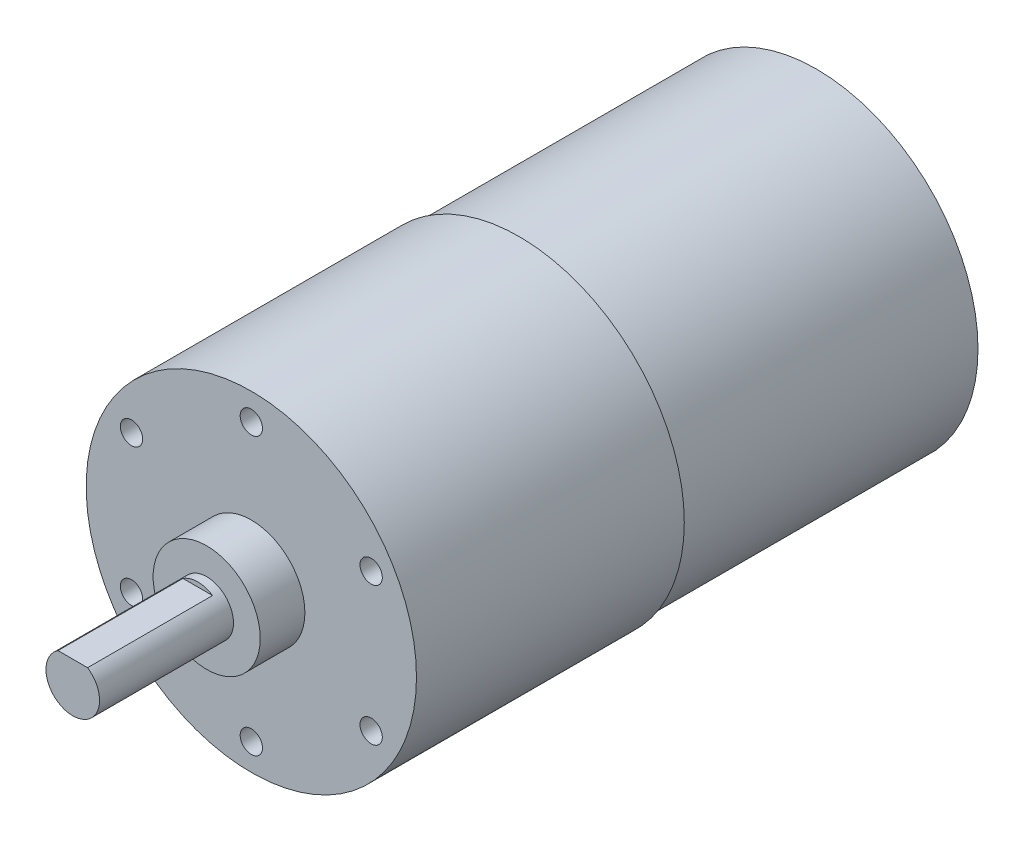
ISO-10303-21;
HEADER;
FILE_DESCRIPTION(('STEP AP214'),'2;1');
FILE_NAME('part.step','',(''),(''),'','','');
FILE_SCHEMA(('AUTOMOTIVE_DESIGN { 1 0 10303 214 1 1 1 1 }'));
ENDSEC;
DATA;
#1=APPLICATION_CONTEXT('core data for automotive mechanical design processes');
#2=APPLICATION_PROTOCOL_DEFINITION('international standard','automotive_design',2000,#1);
#3=PRODUCT_CONTEXT('',#1,'mechanical');
#4=PRODUCT('Part','Part','',(#3));
#5=PRODUCT_RELATED_PRODUCT_CATEGORY('part','',(#4));
#6=PRODUCT_DEFINITION_FORMATION('','',#4);
#7=PRODUCT_DEFINITION_CONTEXT('part definition',#1,'design');
#8=PRODUCT_DEFINITION('design','',#6,#7);
#9=PRODUCT_DEFINITION_SHAPE('','',#8);
#10=(LENGTH_UNIT() NAMED_UNIT(*) SI_UNIT(.MILLI.,.METRE.));
#11=(NAMED_UNIT(*) PLANE_ANGLE_UNIT() SI_UNIT($,.RADIAN.));
#12=(NAMED_UNIT(*) SI_UNIT($,.STERADIAN.) SOLID_ANGLE_UNIT());
#13=UNCERTAINTY_MEASURE_WITH_UNIT(LENGTH_MEASURE(1.E-05),#10,'distance_accuracy_value','');
#14=(GEOMETRIC_REPRESENTATION_CONTEXT(3) GLOBAL_UNCERTAINTY_ASSIGNED_CONTEXT((#13)) GLOBAL_UNIT_ASSIGNED_CONTEXT((#10,
#11,#12)) REPRESENTATION_CONTEXT('',''));
#15=CARTESIAN_POINT('',(0.,0.,0.));
#16=DIRECTION('',(0.,0.,1.));
#17=DIRECTION('',(1.,0.,0.));
#18=AXIS2_PLACEMENT_3D('',#15,#16,#17);
#19=CARTESIAN_POINT('',(0.,0.,30.));
#20=DIRECTION('',(0.,0.,-1.));
#21=DIRECTION('',(-1.,0.,0.));
#22=AXIS2_PLACEMENT_3D('',#19,#20,#21);
#23=CYLINDRICAL_SURFACE('',#22,18.5);
#24=CARTESIAN_POINT('',(0.,0.,30.));
#25=DIRECTION('',(0.,0.,1.));
#26=DIRECTION('',(1.,0.,0.));
#27=AXIS2_PLACEMENT_3D('',#24,#25,#26);
#28=CIRCLE('',#27,18.5);
#29=CARTESIAN_POINT('',(18.5,0.,30.));
#30=VERTEX_POINT('',#29);
#31=EDGE_CURVE('E151',#30,#30,#28,.T.);
#32=ORIENTED_EDGE('',*,*,#31,.F.);
#33=EDGE_LOOP('',(#32));
#34=FACE_BOUND('',#33,.T.);
#35=CARTESIAN_POINT('',(0.,0.,0.));
#36=DIRECTION('',(0.,0.,1.));
#37=DIRECTION('',(1.,0.,0.));
#38=AXIS2_PLACEMENT_3D('',#35,#36,#37);
#39=CIRCLE('',#38,18.5);
#40=CARTESIAN_POINT('',(18.5,0.,0.));
#41=VERTEX_POINT('',#40);
#42=EDGE_CURVE('E40',#41,#41,#39,.T.);
#43=ORIENTED_EDGE('',*,*,#42,.T.);
#44=EDGE_LOOP('',(#43));
#45=FACE_BOUND('',#44,.T.);
#46=ADVANCED_FACE('F37',(#34,#45),#23,.T.);
#47=CARTESIAN_POINT('',(0.,0.,30.));
#48=DIRECTION('',(0.,0.,1.));
#49=DIRECTION('',(1.,0.,0.));
#50=AXIS2_PLACEMENT_3D('',#47,#48,#49);
#51=PLANE('',#50);
#52=CARTESIAN_POINT('',(0.,15.5,30.));
#53=DIRECTION('',(0.,0.,1.));
#54=DIRECTION('',(1.,0.,0.));
#55=AXIS2_PLACEMENT_3D('',#52,#53,#54);
#56=CIRCLE('',#55,1.24999999999999);
#57=CARTESIAN_POINT('',(1.24999999999999,15.5,30.));
#58=VERTEX_POINT('',#57);
#59=EDGE_CURVE('E96',#58,#58,#56,.T.);
#60=ORIENTED_EDGE('',*,*,#59,.F.);
#61=EDGE_LOOP('',(#60));
#62=FACE_BOUND('',#61,.T.);
#63=CARTESIAN_POINT('',(13.4233937586592,7.75000000000076,30.));
#64=DIRECTION('',(0.,0.,1.));
#65=DIRECTION('',(1.,0.,0.));
#66=AXIS2_PLACEMENT_3D('',#63,#64,#65);
#67=CIRCLE('',#66,1.24999999999999);
#68=CARTESIAN_POINT('',(14.6733937586592,7.75000000000076,30.));
#69=VERTEX_POINT('',#68);
#70=EDGE_CURVE('E95',#69,#69,#67,.T.);
#71=ORIENTED_EDGE('',*,*,#70,.F.);
#72=EDGE_LOOP('',(#71));
#73=FACE_BOUND('',#72,.T.);
#74=CARTESIAN_POINT('',(13.4233937586601,-7.74999999999924,30.));
#75=DIRECTION('',(0.,0.,1.));
#76=DIRECTION('',(1.,0.,0.));
#77=AXIS2_PLACEMENT_3D('',#74,#75,#76);
#78=CIRCLE('',#77,1.24999999999999);
#79=CARTESIAN_POINT('',(14.6733937586601,-7.74999999999924,30.));
#80=VERTEX_POINT('',#79);
#81=EDGE_CURVE('E106',#80,#80,#78,.T.);
#82=ORIENTED_EDGE('',*,*,#81,.F.);
#83=EDGE_LOOP('',(#82));
#84=FACE_BOUND('',#83,.T.);
#85=CARTESIAN_POINT('',(1.75834957960769E-12,-15.5,30.));
#86=DIRECTION('',(0.,0.,1.));
#87=DIRECTION('',(1.,0.,0.));
#88=AXIS2_PLACEMENT_3D('',#85,#86,#87);
#89=CIRCLE('',#88,1.24999999999999);
#90=CARTESIAN_POINT('',(1.25000000000175,-15.5,30.));
#91=VERTEX_POINT('',#90);
#92=EDGE_CURVE('E112',#91,#91,#89,.T.);
#93=ORIENTED_EDGE('',*,*,#92,.F.);
#94=EDGE_LOOP('',(#93));
#95=FACE_BOUND('',#94,.T.);
#96=CARTESIAN_POINT('',(-13.4233937586575,-7.75000000000077,30.));
#97=DIRECTION('',(0.,0.,1.));
#98=DIRECTION('',(1.,0.,0.));
#99=AXIS2_PLACEMENT_3D('',#96,#97,#98);
#100=CIRCLE('',#99,1.24999999999999);
#101=CARTESIAN_POINT('',(-12.1733937586575,-7.75000000000077,30.));
#102=VERTEX_POINT('',#101);
#103=EDGE_CURVE('E118',#102,#102,#100,.T.);
#104=ORIENTED_EDGE('',*,*,#103,.F.);
#105=EDGE_LOOP('',(#104));
#106=FACE_BOUND('',#105,.T.);
#107=CARTESIAN_POINT('',(-13.4233937586584,7.74999999999924,30.));
#108=DIRECTION('',(0.,0.,1.));
#109=DIRECTION('',(1.,0.,0.));
#110=AXIS2_PLACEMENT_3D('',#107,#108,#109);
#111=CIRCLE('',#110,1.24999999999999);
#112=CARTESIAN_POINT('',(-12.1733937586584,7.74999999999924,30.));
#113=VERTEX_POINT('',#112);
#114=EDGE_CURVE('E124',#113,#113,#111,.T.);
#115=ORIENTED_EDGE('',*,*,#114,.F.);
#116=EDGE_LOOP('',(#115));
#117=FACE_BOUND('',#116,.T.);
#118=CARTESIAN_POINT('',(0.,0.,30.));
#119=DIRECTION('',(0.,0.,1.));
#120=DIRECTION('',(1.,0.,0.));
#121=AXIS2_PLACEMENT_3D('',#118,#119,#120);
#122=CIRCLE('',#121,6.);
#123=CARTESIAN_POINT('',(6.,0.,30.));
#124=VERTEX_POINT('',#123);
#125=EDGE_CURVE('E45',#124,#124,#122,.T.);
#126=ORIENTED_EDGE('',*,*,#125,.F.);
#127=EDGE_LOOP('',(#126));
#128=FACE_BOUND('',#127,.T.);
#129=ORIENTED_EDGE('',*,*,#31,.T.);
#130=EDGE_LOOP('',(#129));
#131=FACE_BOUND('',#130,.T.);
#132=ADVANCED_FACE('F162',(#62,#73,#84,#95,#106,#117,#128,#131),#51,.T.);
#133=CARTESIAN_POINT('',(0.,0.,0.));
#134=DIRECTION('',(0.,0.,1.));
#135=DIRECTION('',(1.,0.,0.));
#136=AXIS2_PLACEMENT_3D('',#133,#134,#135);
#137=PLANE('',#136);
#138=CARTESIAN_POINT('',(0.,0.,0.));
#139=DIRECTION('',(0.,0.,-1.));
#140=DIRECTION('',(-1.,0.,0.));
#141=AXIS2_PLACEMENT_3D('',#138,#139,#140);
#142=CIRCLE('',#141,18.1);
#143=CARTESIAN_POINT('',(-18.1,0.,0.));
#144=VERTEX_POINT('',#143);
#145=EDGE_CURVE('E147',#144,#144,#142,.T.);
#146=ORIENTED_EDGE('',*,*,#145,.F.);
#147=EDGE_LOOP('',(#146));
#148=FACE_BOUND('',#147,.T.);
#149=ORIENTED_EDGE('',*,*,#42,.F.);
#150=EDGE_LOOP('',(#149));
#151=FACE_BOUND('',#150,.T.);
#152=ADVANCED_FACE('F159',(#148,#151),#137,.F.);
#153=CARTESIAN_POINT('',(0.,0.,-33.3));
#154=DIRECTION('',(0.,0.,1.));
#155=DIRECTION('',(1.,0.,0.));
#156=AXIS2_PLACEMENT_3D('',#153,#154,#155);
#157=CYLINDRICAL_SURFACE('',#156,18.1);
#158=CARTESIAN_POINT('',(0.,0.,-33.3));
#159=DIRECTION('',(0.,0.,-1.));
#160=DIRECTION('',(-1.,0.,0.));
#161=AXIS2_PLACEMENT_3D('',#158,#159,#160);
#162=CIRCLE('',#161,18.1);
#163=CARTESIAN_POINT('',(-18.1,0.,-33.3));
#164=VERTEX_POINT('',#163);
#165=EDGE_CURVE('E144',#164,#164,#162,.T.);
#166=ORIENTED_EDGE('',*,*,#165,.F.);
#167=EDGE_LOOP('',(#166));
#168=FACE_BOUND('',#167,.T.);
#169=ORIENTED_EDGE('',*,*,#145,.T.);
#170=EDGE_LOOP('',(#169));
#171=FACE_BOUND('',#170,.T.);
#172=ADVANCED_FACE('F161',(#168,#171),#157,.T.);
#173=CARTESIAN_POINT('',(0.,0.,-33.3));
#174=DIRECTION('',(0.,0.,-1.));
#175=DIRECTION('',(-1.,0.,0.));
#176=AXIS2_PLACEMENT_3D('',#173,#174,#175);
#177=PLANE('',#176);
#178=ORIENTED_EDGE('',*,*,#165,.T.);
#179=EDGE_LOOP('',(#178));
#180=FACE_BOUND('',#179,.T.);
#181=ADVANCED_FACE('F168',(#180),#177,.T.);
#182=CARTESIAN_POINT('',(0.,0.,35.));
#183=DIRECTION('',(0.,0.,-1.));
#184=DIRECTION('',(-1.,0.,0.));
#185=AXIS2_PLACEMENT_3D('',#182,#183,#184);
#186=CYLINDRICAL_SURFACE('',#185,6.);
#187=CARTESIAN_POINT('',(0.,0.,35.));
#188=DIRECTION('',(0.,0.,1.));
#189=DIRECTION('',(1.,0.,0.));
#190=AXIS2_PLACEMENT_3D('',#187,#188,#189);
#191=CIRCLE('',#190,6.);
#192=CARTESIAN_POINT('',(6.,0.,35.));
#193=VERTEX_POINT('',#192);
#194=EDGE_CURVE('E140',#193,#193,#191,.T.);
#195=ORIENTED_EDGE('',*,*,#194,.F.);
#196=EDGE_LOOP('',(#195));
#197=FACE_BOUND('',#196,.T.);
#198=ORIENTED_EDGE('',*,*,#125,.T.);
#199=EDGE_LOOP('',(#198));
#200=FACE_BOUND('',#199,.T.);
#201=ADVANCED_FACE('F327',(#197,#200),#186,.T.);
#202=CARTESIAN_POINT('',(0.,0.,35.));
#203=DIRECTION('',(0.,0.,1.));
#204=DIRECTION('',(1.,0.,0.));
#205=AXIS2_PLACEMENT_3D('',#202,#203,#204);
#206=PLANE('',#205);
#207=CARTESIAN_POINT('',(0.,0.,35.));
#208=DIRECTION('',(0.,0.,1.));
#209=DIRECTION('',(1.,0.,0.));
#210=AXIS2_PLACEMENT_3D('',#207,#208,#209);
#211=CIRCLE('',#210,3.);
#212=CARTESIAN_POINT('',(3.,0.,35.));
#213=VERTEX_POINT('',#212);
#214=EDGE_CURVE('E11',#213,#213,#211,.T.);
#215=ORIENTED_EDGE('',*,*,#214,.F.);
#216=EDGE_LOOP('',(#215));
#217=FACE_BOUND('',#216,.T.);
#218=ORIENTED_EDGE('',*,*,#194,.T.);
#219=EDGE_LOOP('',(#218));
#220=FACE_BOUND('',#219,.T.);
#221=ADVANCED_FACE('F319',(#217,#220),#206,.T.);
#222=CARTESIAN_POINT('',(0.,0.,36.));
#223=DIRECTION('',(0.,0.,-1.));
#224=DIRECTION('',(-1.,0.,0.));
#225=AXIS2_PLACEMENT_3D('',#222,#223,#224);
#226=CYLINDRICAL_SURFACE('',#225,3.);
#227=CARTESIAN_POINT('',(0.,0.,36.));
#228=DIRECTION('',(0.,0.,1.));
#229=DIRECTION('',(1.,0.,0.));
#230=AXIS2_PLACEMENT_3D('',#227,#228,#229);
#231=CIRCLE('',#230,3.);
#232=CARTESIAN_POINT('',(1.6583123951777,2.5,36.));
#233=VERTEX_POINT('',#232);
#234=CARTESIAN_POINT('',(-1.6583123951777,2.5,36.));
#235=VERTEX_POINT('',#234);
#236=EDGE_CURVE('E66',#233,#235,#231,.T.);
#237=ORIENTED_EDGE('',*,*,#236,.F.);
#238=DIRECTION('',(0.,0.,-1.));
#239=VECTOR('',#238,1.);
#240=CARTESIAN_POINT('',(1.6583123951777,2.5,50.));
#241=LINE('',#240,#239);
#242=CARTESIAN_POINT('',(1.6583123951777,2.5,50.));
#243=VERTEX_POINT('',#242);
#244=EDGE_CURVE('E137',#243,#233,#241,.T.);
#245=ORIENTED_EDGE('',*,*,#244,.F.);
#246=CARTESIAN_POINT('',(0.,0.,50.));
#247=DIRECTION('',(0.,0.,1.));
#248=DIRECTION('',(1.,0.,0.));
#249=AXIS2_PLACEMENT_3D('',#246,#247,#248);
#250=CIRCLE('',#249,3.);
#251=CARTESIAN_POINT('',(-1.6583123951777,2.5,50.));
#252=VERTEX_POINT('',#251);
#253=EDGE_CURVE('E130',#252,#243,#250,.T.);
#254=ORIENTED_EDGE('',*,*,#253,.F.);
#255=DIRECTION('',(0.,0.,-1.));
#256=VECTOR('',#255,1.);
#257=CARTESIAN_POINT('',(-1.6583123951777,2.5,50.));
#258=LINE('',#257,#256);
#259=EDGE_CURVE('E133',#252,#235,#258,.T.);
#260=ORIENTED_EDGE('',*,*,#259,.T.);
#261=EDGE_LOOP('',(#237,#245,#254,#260));
#262=FACE_BOUND('',#261,.T.);
#263=ORIENTED_EDGE('',*,*,#214,.T.);
#264=EDGE_LOOP('',(#263));
#265=FACE_BOUND('',#264,.T.);
#266=ADVANCED_FACE('F312',(#262,#265),#226,.T.);
#267=CARTESIAN_POINT('',(0.,0.,36.));
#268=DIRECTION('',(0.,0.,1.));
#269=DIRECTION('',(1.,0.,0.));
#270=AXIS2_PLACEMENT_3D('',#267,#268,#269);
#271=PLANE('',#270);
#272=DIRECTION('',(-1.,0.,0.));
#273=VECTOR('',#272,1.);
#274=CARTESIAN_POINT('',(-1.6583123951777,2.5,36.));
#275=LINE('',#274,#273);
#276=EDGE_CURVE('E52',#233,#235,#275,.T.);
#277=ORIENTED_EDGE('',*,*,#276,.F.);
#278=ORIENTED_EDGE('',*,*,#236,.T.);
#279=EDGE_LOOP('',(#277,#278));
#280=FACE_BOUND('',#279,.T.);
#281=ADVANCED_FACE('F304',(#280),#271,.T.);
#282=CARTESIAN_POINT('',(-1.6583123951777,2.5,50.));
#283=DIRECTION('',(0.,-1.,0.));
#284=DIRECTION('',(0.,0.,-1.));
#285=AXIS2_PLACEMENT_3D('',#282,#283,#284);
#286=PLANE('',#285);
#287=ORIENTED_EDGE('',*,*,#276,.T.);
#288=ORIENTED_EDGE('',*,*,#259,.F.);
#289=DIRECTION('',(-1.,0.,0.));
#290=VECTOR('',#289,1.);
#291=CARTESIAN_POINT('',(-1.6583123951777,2.5,50.));
#292=LINE('',#291,#290);
#293=EDGE_CURVE('E60',#243,#252,#292,.T.);
#294=ORIENTED_EDGE('',*,*,#293,.F.);
#295=ORIENTED_EDGE('',*,*,#244,.T.);
#296=EDGE_LOOP('',(#287,#288,#294,#295));
#297=FACE_BOUND('',#296,.T.);
#298=ADVANCED_FACE('F297',(#297),#286,.F.);
#299=CARTESIAN_POINT('',(0.,0.,50.));
#300=DIRECTION('',(0.,0.,1.));
#301=DIRECTION('',(1.,0.,0.));
#302=AXIS2_PLACEMENT_3D('',#299,#300,#301);
#303=PLANE('',#302);
#304=ORIENTED_EDGE('',*,*,#253,.T.);
#305=ORIENTED_EDGE('',*,*,#293,.T.);
#306=EDGE_LOOP('',(#304,#305));
#307=FACE_BOUND('',#306,.T.);
#308=ADVANCED_FACE('F289',(#307),#303,.T.);
#309=CARTESIAN_POINT('',(-13.4233937586584,7.74999999999924,24.));
#310=DIRECTION('',(0.,0.,1.));
#311=DIRECTION('',(1.,0.,0.));
#312=AXIS2_PLACEMENT_3D('',#309,#310,#311);
#313=CONICAL_SURFACE('',#312,1.25,1.02974425867665);
#314=CARTESIAN_POINT('',(-13.4233937586584,7.74999999999924,23.2489242262155));
#315=VERTEX_POINT('',#314);
#316=VERTEX_LOOP('',#315);
#317=FACE_BOUND('',#316,.T.);
#318=CARTESIAN_POINT('',(-13.4233937586584,7.74999999999924,24.));
#319=DIRECTION('',(0.,0.,1.));
#320=DIRECTION('',(1.,0.,0.));
#321=AXIS2_PLACEMENT_3D('',#318,#319,#320);
#322=CIRCLE('',#321,1.25);
#323=CARTESIAN_POINT('',(-12.1733937586584,7.74999999999924,24.));
#324=VERTEX_POINT('',#323);
#325=EDGE_CURVE('E127',#324,#324,#322,.T.);
#326=ORIENTED_EDGE('',*,*,#325,.T.);
#327=EDGE_LOOP('',(#326));
#328=FACE_BOUND('',#327,.T.);
#329=ADVANCED_FACE('F280',(#317,#328),#313,.F.);
#330=CARTESIAN_POINT('',(-13.4233937586584,7.74999999999924,30.));
#331=DIRECTION('',(0.,0.,1.));
#332=DIRECTION('',(1.,0.,0.));
#333=AXIS2_PLACEMENT_3D('',#330,#331,#332);
#334=CYLINDRICAL_SURFACE('',#333,1.24999999999999);
#335=ORIENTED_EDGE('',*,*,#325,.F.);
#336=EDGE_LOOP('',(#335));
#337=FACE_BOUND('',#336,.T.);
#338=ORIENTED_EDGE('',*,*,#114,.T.);
#339=EDGE_LOOP('',(#338));
#340=FACE_BOUND('',#339,.T.);
#341=ADVANCED_FACE('F271',(#337,#340),#334,.F.);
#342=CARTESIAN_POINT('',(-13.4233937586575,-7.75000000000077,24.));
#343=DIRECTION('',(0.,0.,1.));
#344=DIRECTION('',(1.,0.,0.));
#345=AXIS2_PLACEMENT_3D('',#342,#343,#344);
#346=CONICAL_SURFACE('',#345,1.25,1.02974425867665);
#347=CARTESIAN_POINT('',(-13.4233937586575,-7.75000000000077,23.2489242262155));
#348=VERTEX_POINT('',#347);
#349=VERTEX_LOOP('',#348);
#350=FACE_BOUND('',#349,.T.);
#351=CARTESIAN_POINT('',(-13.4233937586575,-7.75000000000077,24.));
#352=DIRECTION('',(0.,0.,1.));
#353=DIRECTION('',(1.,0.,0.));
#354=AXIS2_PLACEMENT_3D('',#351,#352,#353);
#355=CIRCLE('',#354,1.25);
#356=CARTESIAN_POINT('',(-12.1733937586575,-7.75000000000077,24.));
#357=VERTEX_POINT('',#356);
#358=EDGE_CURVE('E121',#357,#357,#355,.T.);
#359=ORIENTED_EDGE('',*,*,#358,.T.);
#360=EDGE_LOOP('',(#359));
#361=FACE_BOUND('',#360,.T.);
#362=ADVANCED_FACE('F261',(#350,#361),#346,.F.);
#363=CARTESIAN_POINT('',(-13.4233937586575,-7.75000000000077,30.));
#364=DIRECTION('',(0.,0.,1.));
#365=DIRECTION('',(1.,0.,0.));
#366=AXIS2_PLACEMENT_3D('',#363,#364,#365);
#367=CYLINDRICAL_SURFACE('',#366,1.24999999999999);
#368=ORIENTED_EDGE('',*,*,#358,.F.);
#369=EDGE_LOOP('',(#368));
#370=FACE_BOUND('',#369,.T.);
#371=ORIENTED_EDGE('',*,*,#103,.T.);
#372=EDGE_LOOP('',(#371));
#373=FACE_BOUND('',#372,.T.);
#374=ADVANCED_FACE('F252',(#370,#373),#367,.F.);
#375=CARTESIAN_POINT('',(1.75834957960769E-12,-15.5,24.));
#376=DIRECTION('',(0.,0.,1.));
#377=DIRECTION('',(1.,0.,0.));
#378=AXIS2_PLACEMENT_3D('',#375,#376,#377);
#379=CONICAL_SURFACE('',#378,1.25,1.02974425867665);
#380=CARTESIAN_POINT('',(1.75669604294026E-12,-15.5,23.2489242262155));
#381=VERTEX_POINT('',#380);
#382=VERTEX_LOOP('',#381);
#383=FACE_BOUND('',#382,.T.);
#384=CARTESIAN_POINT('',(1.75834957960769E-12,-15.5,24.));
#385=DIRECTION('',(0.,0.,1.));
#386=DIRECTION('',(1.,0.,0.));
#387=AXIS2_PLACEMENT_3D('',#384,#385,#386);
#388=CIRCLE('',#387,1.25);
#389=CARTESIAN_POINT('',(1.25000000000176,-15.5,24.));
#390=VERTEX_POINT('',#389);
#391=EDGE_CURVE('E115',#390,#390,#388,.T.);
#392=ORIENTED_EDGE('',*,*,#391,.T.);
#393=EDGE_LOOP('',(#392));
#394=FACE_BOUND('',#393,.T.);
#395=ADVANCED_FACE('F242',(#383,#394),#379,.F.);
#396=CARTESIAN_POINT('',(1.75834957960769E-12,-15.5,30.));
#397=DIRECTION('',(0.,0.,1.));
#398=DIRECTION('',(1.,0.,0.));
#399=AXIS2_PLACEMENT_3D('',#396,#397,#398);
#400=CYLINDRICAL_SURFACE('',#399,1.24999999999999);
#401=ORIENTED_EDGE('',*,*,#391,.F.);
#402=EDGE_LOOP('',(#401));
#403=FACE_BOUND('',#402,.T.);
#404=ORIENTED_EDGE('',*,*,#92,.T.);
#405=EDGE_LOOP('',(#404));
#406=FACE_BOUND('',#405,.T.);
#407=ADVANCED_FACE('F233',(#403,#406),#400,.F.);
#408=CARTESIAN_POINT('',(13.4233937586601,-7.74999999999924,24.));
#409=DIRECTION('',(0.,0.,1.));
#410=DIRECTION('',(1.,0.,0.));
#411=AXIS2_PLACEMENT_3D('',#408,#409,#410);
#412=CONICAL_SURFACE('',#411,1.25,1.02974425867665);
#413=CARTESIAN_POINT('',(13.4233937586601,-7.74999999999924,23.2489242262155));
#414=VERTEX_POINT('',#413);
#415=VERTEX_LOOP('',#414);
#416=FACE_BOUND('',#415,.T.);
#417=CARTESIAN_POINT('',(13.4233937586601,-7.74999999999924,24.));
#418=DIRECTION('',(0.,0.,1.));
#419=DIRECTION('',(1.,0.,0.));
#420=AXIS2_PLACEMENT_3D('',#417,#418,#419);
#421=CIRCLE('',#420,1.25);
#422=CARTESIAN_POINT('',(14.6733937586601,-7.74999999999924,24.));
#423=VERTEX_POINT('',#422);
#424=EDGE_CURVE('E109',#423,#423,#421,.T.);
#425=ORIENTED_EDGE('',*,*,#424,.T.);
#426=EDGE_LOOP('',(#425));
#427=FACE_BOUND('',#426,.T.);
#428=ADVANCED_FACE('F223',(#416,#427),#412,.F.);
#429=CARTESIAN_POINT('',(13.4233937586601,-7.74999999999924,30.));
#430=DIRECTION('',(0.,0.,1.));
#431=DIRECTION('',(1.,0.,0.));
#432=AXIS2_PLACEMENT_3D('',#429,#430,#431);
#433=CYLINDRICAL_SURFACE('',#432,1.24999999999999);
#434=ORIENTED_EDGE('',*,*,#424,.F.);
#435=EDGE_LOOP('',(#434));
#436=FACE_BOUND('',#435,.T.);
#437=ORIENTED_EDGE('',*,*,#81,.T.);
#438=EDGE_LOOP('',(#437));
#439=FACE_BOUND('',#438,.T.);
#440=ADVANCED_FACE('F214',(#436,#439),#433,.F.);
#441=CARTESIAN_POINT('',(13.4233937586592,7.75000000000076,24.));
#442=DIRECTION('',(0.,0.,1.));
#443=DIRECTION('',(1.,0.,0.));
#444=AXIS2_PLACEMENT_3D('',#441,#442,#443);
#445=CONICAL_SURFACE('',#444,1.25,1.02974425867665);
#446=CARTESIAN_POINT('',(13.4233937586592,7.75000000000076,23.2489242262155));
#447=VERTEX_POINT('',#446);
#448=VERTEX_LOOP('',#447);
#449=FACE_BOUND('',#448,.T.);
#450=CARTESIAN_POINT('',(13.4233937586592,7.75000000000076,24.));
#451=DIRECTION('',(0.,0.,1.));
#452=DIRECTION('',(1.,0.,0.));
#453=AXIS2_PLACEMENT_3D('',#450,#451,#452);
#454=CIRCLE('',#453,1.25);
#455=CARTESIAN_POINT('',(14.6733937586592,7.75000000000076,24.));
#456=VERTEX_POINT('',#455);
#457=EDGE_CURVE('E99',#456,#456,#454,.T.);
#458=ORIENTED_EDGE('',*,*,#457,.T.);
#459=EDGE_LOOP('',(#458));
#460=FACE_BOUND('',#459,.T.);
#461=ADVANCED_FACE('F206',(#449,#460),#445,.F.);
#462=CARTESIAN_POINT('',(13.4233937586592,7.75000000000076,30.));
#463=DIRECTION('',(0.,0.,1.));
#464=DIRECTION('',(1.,0.,0.));
#465=AXIS2_PLACEMENT_3D('',#462,#463,#464);
#466=CYLINDRICAL_SURFACE('',#465,1.24999999999999);
#467=ORIENTED_EDGE('',*,*,#457,.F.);
#468=EDGE_LOOP('',(#467));
#469=FACE_BOUND('',#468,.T.);
#470=ORIENTED_EDGE('',*,*,#70,.T.);
#471=EDGE_LOOP('',(#470));
#472=FACE_BOUND('',#471,.T.);
#473=ADVANCED_FACE('F89',(#469,#472),#466,.F.);
#474=CARTESIAN_POINT('',(0.,15.5,24.));
#475=DIRECTION('',(0.,0.,1.));
#476=DIRECTION('',(1.,0.,0.));
#477=AXIS2_PLACEMENT_3D('',#474,#475,#476);
#478=CONICAL_SURFACE('',#477,1.25,1.02974425867665);
#479=CARTESIAN_POINT('',(0.,15.5,23.2489242262155));
#480=VERTEX_POINT('',#479);
#481=VERTEX_LOOP('',#480);
#482=FACE_BOUND('',#481,.T.);
#483=CARTESIAN_POINT('',(0.,15.5,24.));
#484=DIRECTION('',(0.,0.,1.));
#485=DIRECTION('',(1.,0.,0.));
#486=AXIS2_PLACEMENT_3D('',#483,#484,#485);
#487=CIRCLE('',#486,1.25);
#488=CARTESIAN_POINT('',(1.25,15.5,24.));
#489=VERTEX_POINT('',#488);
#490=EDGE_CURVE('E93',#489,#489,#487,.T.);
#491=ORIENTED_EDGE('',*,*,#490,.T.);
#492=EDGE_LOOP('',(#491));
#493=FACE_BOUND('',#492,.T.);
#494=ADVANCED_FACE('F85',(#482,#493),#478,.F.);
#495=CARTESIAN_POINT('',(0.,15.5,30.));
#496=DIRECTION('',(0.,0.,1.));
#497=DIRECTION('',(1.,0.,0.));
#498=AXIS2_PLACEMENT_3D('',#495,#496,#497);
#499=CYLINDRICAL_SURFACE('',#498,1.24999999999999);
#500=ORIENTED_EDGE('',*,*,#490,.F.);
#501=EDGE_LOOP('',(#500));
#502=FACE_BOUND('',#501,.T.);
#503=ORIENTED_EDGE('',*,*,#59,.T.);
#504=EDGE_LOOP('',(#503));
#505=FACE_BOUND('',#504,.T.);
#506=ADVANCED_FACE('F88',(#502,#505),#499,.F.);
#507=CLOSED_SHELL('',(#46,#132,#152,#172,#181,#201,#221,#266,#281,#298,#308,#329,#341,#362,#374,
#395,#407,#428,#440,#461,#473,#494,#506));
#508=MANIFOLD_SOLID_BREP('B2',#507);
#509=ADVANCED_BREP_SHAPE_REPRESENTATION('',(#18,#508),#14);
#510=SHAPE_DEFINITION_REPRESENTATION(#9,#509);
ENDSEC;
END-ISO-10303-21;
